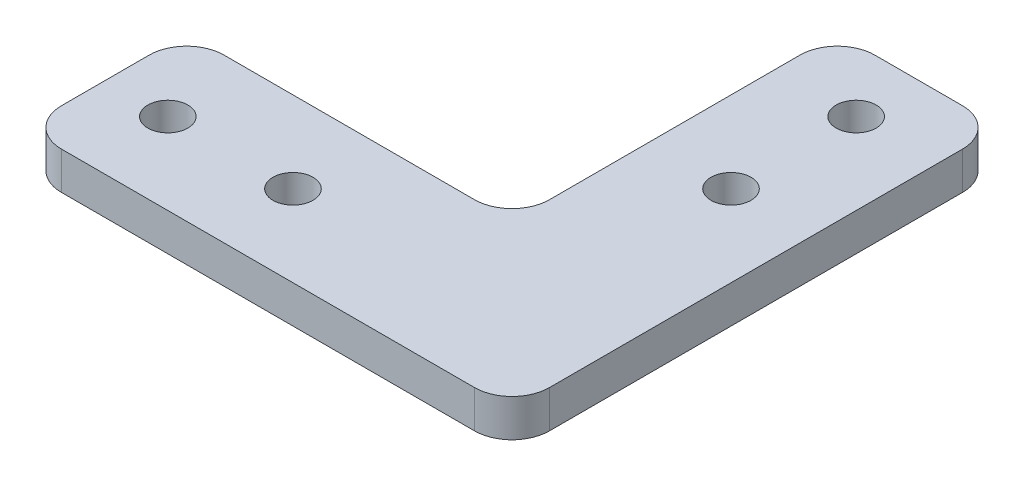
ISO-10303-21;
HEADER;
FILE_DESCRIPTION(('STEP AP214'),'2;1');
FILE_NAME('part.step','',(''),(''),'','','');
FILE_SCHEMA(('AUTOMOTIVE_DESIGN { 1 0 10303 214 1 1 1 1 }'));
ENDSEC;
DATA;
#1=APPLICATION_CONTEXT('core data for automotive mechanical design processes');
#2=APPLICATION_PROTOCOL_DEFINITION('international standard','automotive_design',2000,#1);
#3=PRODUCT_CONTEXT('',#1,'mechanical');
#4=PRODUCT('Part','Part','',(#3));
#5=PRODUCT_RELATED_PRODUCT_CATEGORY('part','',(#4));
#6=PRODUCT_DEFINITION_FORMATION('','',#4);
#7=PRODUCT_DEFINITION_CONTEXT('part definition',#1,'design');
#8=PRODUCT_DEFINITION('design','',#6,#7);
#9=PRODUCT_DEFINITION_SHAPE('','',#8);
#10=(LENGTH_UNIT() NAMED_UNIT(*) SI_UNIT(.MILLI.,.METRE.));
#11=(NAMED_UNIT(*) PLANE_ANGLE_UNIT() SI_UNIT($,.RADIAN.));
#12=(NAMED_UNIT(*) SI_UNIT($,.STERADIAN.) SOLID_ANGLE_UNIT());
#13=UNCERTAINTY_MEASURE_WITH_UNIT(LENGTH_MEASURE(1.E-05),#10,'distance_accuracy_value','');
#14=(GEOMETRIC_REPRESENTATION_CONTEXT(3) GLOBAL_UNCERTAINTY_ASSIGNED_CONTEXT((#13)) GLOBAL_UNIT_ASSIGNED_CONTEXT((#10,
#11,#12)) REPRESENTATION_CONTEXT('',''));
#15=CARTESIAN_POINT('',(0.,0.,0.));
#16=DIRECTION('',(0.,0.,1.));
#17=DIRECTION('',(1.,0.,0.));
#18=AXIS2_PLACEMENT_3D('',#15,#16,#17);
#19=CARTESIAN_POINT('',(-13.,3.,0.));
#20=DIRECTION('',(-1.,0.,0.));
#21=DIRECTION('',(0.,0.,1.));
#22=AXIS2_PLACEMENT_3D('',#19,#20,#21);
#23=PLANE('',#22);
#24=DIRECTION('',(0.,0.,-1.));
#25=VECTOR('',#24,1.);
#26=CARTESIAN_POINT('',(-13.,3.,0.));
#27=LINE('',#26,#25);
#28=CARTESIAN_POINT('',(-13.,3.,-16.));
#29=VERTEX_POINT('',#28);
#30=CARTESIAN_POINT('',(-13.,3.,-36.));
#31=VERTEX_POINT('',#30);
#32=EDGE_CURVE('E242',#29,#31,#27,.T.);
#33=ORIENTED_EDGE('',*,*,#32,.T.);
#34=DIRECTION('',(0.,-1.,0.));
#35=VECTOR('',#34,1.);
#36=CARTESIAN_POINT('',(-13.,0.,-36.));
#37=LINE('',#36,#35);
#38=CARTESIAN_POINT('',(-13.,0.,-36.));
#39=VERTEX_POINT('',#38);
#40=EDGE_CURVE('E148',#31,#39,#37,.T.);
#41=ORIENTED_EDGE('',*,*,#40,.T.);
#42=DIRECTION('',(0.,0.,-1.));
#43=VECTOR('',#42,1.);
#44=CARTESIAN_POINT('',(-13.,0.,0.));
#45=LINE('',#44,#43);
#46=CARTESIAN_POINT('',(-13.,0.,-16.));
#47=VERTEX_POINT('',#46);
#48=EDGE_CURVE('E135',#47,#39,#45,.T.);
#49=ORIENTED_EDGE('',*,*,#48,.F.);
#50=DIRECTION('',(0.,-1.,0.));
#51=VECTOR('',#50,1.);
#52=CARTESIAN_POINT('',(-13.,3.,-16.));
#53=LINE('',#52,#51);
#54=EDGE_CURVE('E145',#47,#29,#53,.F.);
#55=ORIENTED_EDGE('',*,*,#54,.T.);
#56=EDGE_LOOP('',(#33,#41,#49,#55));
#57=FACE_BOUND('',#56,.T.);
#58=ADVANCED_FACE('F43',(#57),#23,.T.);
#59=CARTESIAN_POINT('',(0.,3.,-13.));
#60=DIRECTION('',(0.,0.,-1.));
#61=DIRECTION('',(-1.,0.,0.));
#62=AXIS2_PLACEMENT_3D('',#59,#60,#61);
#63=PLANE('',#62);
#64=DIRECTION('',(1.,0.,0.));
#65=VECTOR('',#64,1.);
#66=CARTESIAN_POINT('',(0.,0.,-13.));
#67=LINE('',#66,#65);
#68=CARTESIAN_POINT('',(-36.,0.,-13.));
#69=VERTEX_POINT('',#68);
#70=CARTESIAN_POINT('',(-16.,0.,-13.));
#71=VERTEX_POINT('',#70);
#72=EDGE_CURVE('E137',#69,#71,#67,.T.);
#73=ORIENTED_EDGE('',*,*,#72,.F.);
#74=DIRECTION('',(0.,-1.,0.));
#75=VECTOR('',#74,1.);
#76=CARTESIAN_POINT('',(-36.,3.,-13.));
#77=LINE('',#76,#75);
#78=CARTESIAN_POINT('',(-36.,3.,-13.));
#79=VERTEX_POINT('',#78);
#80=EDGE_CURVE('E199',#69,#79,#77,.F.);
#81=ORIENTED_EDGE('',*,*,#80,.T.);
#82=DIRECTION('',(1.,0.,0.));
#83=VECTOR('',#82,1.);
#84=CARTESIAN_POINT('',(0.,3.,-13.));
#85=LINE('',#84,#83);
#86=CARTESIAN_POINT('',(-16.,3.,-13.));
#87=VERTEX_POINT('',#86);
#88=EDGE_CURVE('E239',#79,#87,#85,.T.);
#89=ORIENTED_EDGE('',*,*,#88,.T.);
#90=DIRECTION('',(0.,-1.,0.));
#91=VECTOR('',#90,1.);
#92=CARTESIAN_POINT('',(-16.,0.,-13.));
#93=LINE('',#92,#91);
#94=EDGE_CURVE('E197',#87,#71,#93,.T.);
#95=ORIENTED_EDGE('',*,*,#94,.T.);
#96=EDGE_LOOP('',(#73,#81,#89,#95));
#97=FACE_BOUND('',#96,.T.);
#98=ADVANCED_FACE('F287',(#97),#63,.T.);
#99=CARTESIAN_POINT('',(-39.,3.,0.));
#100=DIRECTION('',(-1.,0.,0.));
#101=DIRECTION('',(0.,0.,1.));
#102=AXIS2_PLACEMENT_3D('',#99,#100,#101);
#103=PLANE('',#102);
#104=DIRECTION('',(0.,0.,-1.));
#105=VECTOR('',#104,1.);
#106=CARTESIAN_POINT('',(-39.,0.,0.));
#107=LINE('',#106,#105);
#108=CARTESIAN_POINT('',(-39.,0.,-3.));
#109=VERTEX_POINT('',#108);
#110=CARTESIAN_POINT('',(-39.,0.,-9.99999999999999));
#111=VERTEX_POINT('',#110);
#112=EDGE_CURVE('E215',#109,#111,#107,.T.);
#113=ORIENTED_EDGE('',*,*,#112,.F.);
#114=DIRECTION('',(0.,-1.,0.));
#115=VECTOR('',#114,1.);
#116=CARTESIAN_POINT('',(-39.,3.,-3.));
#117=LINE('',#116,#115);
#118=CARTESIAN_POINT('',(-39.,3.,-3.));
#119=VERTEX_POINT('',#118);
#120=EDGE_CURVE('E195',#109,#119,#117,.F.);
#121=ORIENTED_EDGE('',*,*,#120,.T.);
#122=DIRECTION('',(0.,0.,-1.));
#123=VECTOR('',#122,1.);
#124=CARTESIAN_POINT('',(-39.,3.,0.));
#125=LINE('',#124,#123);
#126=CARTESIAN_POINT('',(-39.,3.,-9.99999999999999));
#127=VERTEX_POINT('',#126);
#128=EDGE_CURVE('E236',#119,#127,#125,.T.);
#129=ORIENTED_EDGE('',*,*,#128,.T.);
#130=DIRECTION('',(0.,-1.,0.));
#131=VECTOR('',#130,1.);
#132=CARTESIAN_POINT('',(-39.,3.,-9.99999999999999));
#133=LINE('',#132,#131);
#134=EDGE_CURVE('E192',#127,#111,#133,.T.);
#135=ORIENTED_EDGE('',*,*,#134,.T.);
#136=EDGE_LOOP('',(#113,#121,#129,#135));
#137=FACE_BOUND('',#136,.T.);
#138=ADVANCED_FACE('F293',(#137),#103,.T.);
#139=CARTESIAN_POINT('',(0.,3.,0.));
#140=DIRECTION('',(0.,0.,1.));
#141=DIRECTION('',(1.,0.,0.));
#142=AXIS2_PLACEMENT_3D('',#139,#140,#141);
#143=PLANE('',#142);
#144=DIRECTION('',(-1.,0.,0.));
#145=VECTOR('',#144,1.);
#146=CARTESIAN_POINT('',(0.,3.,0.));
#147=LINE('',#146,#145);
#148=CARTESIAN_POINT('',(-3.,3.,0.));
#149=VERTEX_POINT('',#148);
#150=CARTESIAN_POINT('',(-36.,3.,0.));
#151=VERTEX_POINT('',#150);
#152=EDGE_CURVE('E233',#149,#151,#147,.T.);
#153=ORIENTED_EDGE('',*,*,#152,.T.);
#154=DIRECTION('',(0.,-1.,0.));
#155=VECTOR('',#154,1.);
#156=CARTESIAN_POINT('',(-36.,3.,0.));
#157=LINE('',#156,#155);
#158=CARTESIAN_POINT('',(-36.,0.,0.));
#159=VERTEX_POINT('',#158);
#160=EDGE_CURVE('E189',#151,#159,#157,.T.);
#161=ORIENTED_EDGE('',*,*,#160,.T.);
#162=DIRECTION('',(-1.,0.,0.));
#163=VECTOR('',#162,1.);
#164=CARTESIAN_POINT('',(0.,0.,0.));
#165=LINE('',#164,#163);
#166=CARTESIAN_POINT('',(-3.,0.,0.));
#167=VERTEX_POINT('',#166);
#168=EDGE_CURVE('E212',#167,#159,#165,.T.);
#169=ORIENTED_EDGE('',*,*,#168,.F.);
#170=DIRECTION('',(0.,-1.,0.));
#171=VECTOR('',#170,1.);
#172=CARTESIAN_POINT('',(-3.,3.,0.));
#173=LINE('',#172,#171);
#174=EDGE_CURVE('E187',#167,#149,#173,.F.);
#175=ORIENTED_EDGE('',*,*,#174,.T.);
#176=EDGE_LOOP('',(#153,#161,#169,#175));
#177=FACE_BOUND('',#176,.T.);
#178=ADVANCED_FACE('F332',(#177),#143,.T.);
#179=CARTESIAN_POINT('',(0.,3.,0.));
#180=DIRECTION('',(-1.,0.,0.));
#181=DIRECTION('',(0.,0.,1.));
#182=AXIS2_PLACEMENT_3D('',#179,#180,#181);
#183=PLANE('',#182);
#184=DIRECTION('',(0.,0.,-1.));
#185=VECTOR('',#184,1.);
#186=CARTESIAN_POINT('',(0.,0.,0.));
#187=LINE('',#186,#185);
#188=CARTESIAN_POINT('',(0.,0.,-3.));
#189=VERTEX_POINT('',#188);
#190=CARTESIAN_POINT('',(0.,0.,-36.));
#191=VERTEX_POINT('',#190);
#192=EDGE_CURVE('E207',#189,#191,#187,.T.);
#193=ORIENTED_EDGE('',*,*,#192,.T.);
#194=DIRECTION('',(0.,-1.,0.));
#195=VECTOR('',#194,1.);
#196=CARTESIAN_POINT('',(0.,3.,-36.));
#197=LINE('',#196,#195);
#198=CARTESIAN_POINT('',(0.,3.,-36.));
#199=VERTEX_POINT('',#198);
#200=EDGE_CURVE('E58',#191,#199,#197,.F.);
#201=ORIENTED_EDGE('',*,*,#200,.T.);
#202=DIRECTION('',(0.,0.,-1.));
#203=VECTOR('',#202,1.);
#204=CARTESIAN_POINT('',(0.,3.,0.));
#205=LINE('',#204,#203);
#206=CARTESIAN_POINT('',(0.,3.,-3.));
#207=VERTEX_POINT('',#206);
#208=EDGE_CURVE('E158',#207,#199,#205,.T.);
#209=ORIENTED_EDGE('',*,*,#208,.F.);
#210=DIRECTION('',(0.,-1.,0.));
#211=VECTOR('',#210,1.);
#212=CARTESIAN_POINT('',(0.,0.,-3.));
#213=LINE('',#212,#211);
#214=EDGE_CURVE('E201',#207,#189,#213,.T.);
#215=ORIENTED_EDGE('',*,*,#214,.T.);
#216=EDGE_LOOP('',(#193,#201,#209,#215));
#217=FACE_BOUND('',#216,.T.);
#218=ADVANCED_FACE('F206',(#217),#183,.F.);
#219=CARTESIAN_POINT('',(-24.,3.,-6.49999999999999));
#220=DIRECTION('',(0.,-1.,0.));
#221=DIRECTION('',(0.,0.,-1.));
#222=AXIS2_PLACEMENT_3D('',#219,#220,#221);
#223=CYLINDRICAL_SURFACE('',#222,1.6);
#224=CARTESIAN_POINT('',(-24.,3.,-6.49999999999999));
#225=DIRECTION('',(0.,1.,0.));
#226=DIRECTION('',(0.,0.,1.));
#227=AXIS2_PLACEMENT_3D('',#224,#225,#226);
#228=CIRCLE('',#227,1.6);
#229=CARTESIAN_POINT('',(-24.,3.,-4.89999999999999));
#230=VERTEX_POINT('',#229);
#231=EDGE_CURVE('E244',#230,#230,#228,.T.);
#232=ORIENTED_EDGE('',*,*,#231,.T.);
#233=EDGE_LOOP('',(#232));
#234=FACE_BOUND('',#233,.T.);
#235=CARTESIAN_POINT('',(-24.,0.,-6.49999999999999));
#236=DIRECTION('',(0.,1.,0.));
#237=DIRECTION('',(0.,0.,1.));
#238=AXIS2_PLACEMENT_3D('',#235,#236,#237);
#239=CIRCLE('',#238,1.6);
#240=CARTESIAN_POINT('',(-24.,0.,-4.89999999999999));
#241=VERTEX_POINT('',#240);
#242=EDGE_CURVE('E149',#241,#241,#239,.T.);
#243=ORIENTED_EDGE('',*,*,#242,.F.);
#244=EDGE_LOOP('',(#243));
#245=FACE_BOUND('',#244,.T.);
#246=ADVANCED_FACE('F298',(#234,#245),#223,.F.);
#247=CARTESIAN_POINT('',(-34.,3.,-6.49999999999999));
#248=DIRECTION('',(0.,-1.,0.));
#249=DIRECTION('',(0.,0.,-1.));
#250=AXIS2_PLACEMENT_3D('',#247,#248,#249);
#251=CYLINDRICAL_SURFACE('',#250,1.6);
#252=CARTESIAN_POINT('',(-34.,3.,-6.49999999999999));
#253=DIRECTION('',(0.,1.,0.));
#254=DIRECTION('',(0.,0.,1.));
#255=AXIS2_PLACEMENT_3D('',#252,#253,#254);
#256=CIRCLE('',#255,1.6);
#257=CARTESIAN_POINT('',(-34.,3.,-4.9));
#258=VERTEX_POINT('',#257);
#259=EDGE_CURVE('E247',#258,#258,#256,.T.);
#260=ORIENTED_EDGE('',*,*,#259,.T.);
#261=EDGE_LOOP('',(#260));
#262=FACE_BOUND('',#261,.T.);
#263=CARTESIAN_POINT('',(-34.,0.,-6.49999999999999));
#264=DIRECTION('',(0.,1.,0.));
#265=DIRECTION('',(0.,0.,1.));
#266=AXIS2_PLACEMENT_3D('',#263,#264,#265);
#267=CIRCLE('',#266,1.6);
#268=CARTESIAN_POINT('',(-34.,0.,-4.9));
#269=VERTEX_POINT('',#268);
#270=EDGE_CURVE('E223',#269,#269,#267,.T.);
#271=ORIENTED_EDGE('',*,*,#270,.F.);
#272=EDGE_LOOP('',(#271));
#273=FACE_BOUND('',#272,.T.);
#274=ADVANCED_FACE('F301',(#262,#273),#251,.F.);
#275=CARTESIAN_POINT('',(-6.5,3.,-24.));
#276=DIRECTION('',(0.,-1.,0.));
#277=DIRECTION('',(0.,0.,-1.));
#278=AXIS2_PLACEMENT_3D('',#275,#276,#277);
#279=CYLINDRICAL_SURFACE('',#278,1.6);
#280=CARTESIAN_POINT('',(-6.5,3.,-24.));
#281=DIRECTION('',(0.,1.,0.));
#282=DIRECTION('',(0.,0.,1.));
#283=AXIS2_PLACEMENT_3D('',#280,#281,#282);
#284=CIRCLE('',#283,1.6);
#285=CARTESIAN_POINT('',(-6.5,3.,-22.4));
#286=VERTEX_POINT('',#285);
#287=EDGE_CURVE('E250',#286,#286,#284,.T.);
#288=ORIENTED_EDGE('',*,*,#287,.T.);
#289=EDGE_LOOP('',(#288));
#290=FACE_BOUND('',#289,.T.);
#291=CARTESIAN_POINT('',(-6.5,0.,-24.));
#292=DIRECTION('',(0.,1.,0.));
#293=DIRECTION('',(0.,0.,1.));
#294=AXIS2_PLACEMENT_3D('',#291,#292,#293);
#295=CIRCLE('',#294,1.6);
#296=CARTESIAN_POINT('',(-6.5,0.,-22.4));
#297=VERTEX_POINT('',#296);
#298=EDGE_CURVE('E226',#297,#297,#295,.T.);
#299=ORIENTED_EDGE('',*,*,#298,.F.);
#300=EDGE_LOOP('',(#299));
#301=FACE_BOUND('',#300,.T.);
#302=ADVANCED_FACE('F305',(#290,#301),#279,.F.);
#303=CARTESIAN_POINT('',(-6.5,3.,-34.));
#304=DIRECTION('',(0.,-1.,0.));
#305=DIRECTION('',(0.,0.,-1.));
#306=AXIS2_PLACEMENT_3D('',#303,#304,#305);
#307=CYLINDRICAL_SURFACE('',#306,1.6);
#308=CARTESIAN_POINT('',(-6.5,3.,-34.));
#309=DIRECTION('',(0.,1.,0.));
#310=DIRECTION('',(0.,0.,1.));
#311=AXIS2_PLACEMENT_3D('',#308,#309,#310);
#312=CIRCLE('',#311,1.6);
#313=CARTESIAN_POINT('',(-6.5,3.,-32.4));
#314=VERTEX_POINT('',#313);
#315=EDGE_CURVE('E214',#314,#314,#312,.T.);
#316=ORIENTED_EDGE('',*,*,#315,.T.);
#317=EDGE_LOOP('',(#316));
#318=FACE_BOUND('',#317,.T.);
#319=CARTESIAN_POINT('',(-6.5,0.,-34.));
#320=DIRECTION('',(0.,1.,0.));
#321=DIRECTION('',(0.,0.,1.));
#322=AXIS2_PLACEMENT_3D('',#319,#320,#321);
#323=CIRCLE('',#322,1.6);
#324=CARTESIAN_POINT('',(-6.5,0.,-32.4));
#325=VERTEX_POINT('',#324);
#326=EDGE_CURVE('E229',#325,#325,#323,.T.);
#327=ORIENTED_EDGE('',*,*,#326,.F.);
#328=EDGE_LOOP('',(#327));
#329=FACE_BOUND('',#328,.T.);
#330=ADVANCED_FACE('F256',(#318,#329),#307,.F.);
#331=CARTESIAN_POINT('',(0.,3.,-39.));
#332=DIRECTION('',(0.,0.,1.));
#333=DIRECTION('',(1.,0.,0.));
#334=AXIS2_PLACEMENT_3D('',#331,#332,#333);
#335=PLANE('',#334);
#336=DIRECTION('',(-1.,0.,0.));
#337=VECTOR('',#336,1.);
#338=CARTESIAN_POINT('',(0.,0.,-39.));
#339=LINE('',#338,#337);
#340=CARTESIAN_POINT('',(-3.,0.,-39.));
#341=VERTEX_POINT('',#340);
#342=CARTESIAN_POINT('',(-10.,0.,-39.));
#343=VERTEX_POINT('',#342);
#344=EDGE_CURVE('E161',#341,#343,#339,.T.);
#345=ORIENTED_EDGE('',*,*,#344,.T.);
#346=DIRECTION('',(0.,-1.,0.));
#347=VECTOR('',#346,1.);
#348=CARTESIAN_POINT('',(-10.,3.,-39.));
#349=LINE('',#348,#347);
#350=CARTESIAN_POINT('',(-10.,3.,-39.));
#351=VERTEX_POINT('',#350);
#352=EDGE_CURVE('E176',#343,#351,#349,.F.);
#353=ORIENTED_EDGE('',*,*,#352,.T.);
#354=DIRECTION('',(-1.,0.,0.));
#355=VECTOR('',#354,1.);
#356=CARTESIAN_POINT('',(0.,3.,-39.));
#357=LINE('',#356,#355);
#358=CARTESIAN_POINT('',(-3.,3.,-39.));
#359=VERTEX_POINT('',#358);
#360=EDGE_CURVE('E153',#359,#351,#357,.T.);
#361=ORIENTED_EDGE('',*,*,#360,.F.);
#362=DIRECTION('',(0.,-1.,0.));
#363=VECTOR('',#362,1.);
#364=CARTESIAN_POINT('',(-3.,3.,-39.));
#365=LINE('',#364,#363);
#366=EDGE_CURVE('E173',#359,#341,#365,.T.);
#367=ORIENTED_EDGE('',*,*,#366,.T.);
#368=EDGE_LOOP('',(#345,#353,#361,#367));
#369=FACE_BOUND('',#368,.T.);
#370=ADVANCED_FACE('F262',(#369),#335,.F.);
#371=CARTESIAN_POINT('',(0.,3.,0.));
#372=DIRECTION('',(0.,1.,0.));
#373=DIRECTION('',(0.,0.,1.));
#374=AXIS2_PLACEMENT_3D('',#371,#372,#373);
#375=PLANE('',#374);
#376=ORIENTED_EDGE('',*,*,#315,.F.);
#377=EDGE_LOOP('',(#376));
#378=FACE_BOUND('',#377,.T.);
#379=ORIENTED_EDGE('',*,*,#287,.F.);
#380=EDGE_LOOP('',(#379));
#381=FACE_BOUND('',#380,.T.);
#382=ORIENTED_EDGE('',*,*,#259,.F.);
#383=EDGE_LOOP('',(#382));
#384=FACE_BOUND('',#383,.T.);
#385=ORIENTED_EDGE('',*,*,#231,.F.);
#386=EDGE_LOOP('',(#385));
#387=FACE_BOUND('',#386,.T.);
#388=ORIENTED_EDGE('',*,*,#360,.T.);
#389=CARTESIAN_POINT('',(-10.,3.,-36.));
#390=DIRECTION('',(0.,1.,0.));
#391=DIRECTION('',(0.,0.,1.));
#392=AXIS2_PLACEMENT_3D('',#389,#390,#391);
#393=CIRCLE('',#392,3.);
#394=EDGE_CURVE('E185',#351,#31,#393,.T.);
#395=ORIENTED_EDGE('',*,*,#394,.T.);
#396=ORIENTED_EDGE('',*,*,#32,.F.);
#397=CARTESIAN_POINT('',(-16.,3.,-16.));
#398=DIRECTION('',(0.,1.,0.));
#399=DIRECTION('',(0.,0.,1.));
#400=AXIS2_PLACEMENT_3D('',#397,#398,#399);
#401=CIRCLE('',#400,3.);
#402=EDGE_CURVE('E11',#29,#87,#401,.F.);
#403=ORIENTED_EDGE('',*,*,#402,.T.);
#404=ORIENTED_EDGE('',*,*,#88,.F.);
#405=CARTESIAN_POINT('',(-36.,3.,-9.99999999999999));
#406=DIRECTION('',(0.,1.,0.));
#407=DIRECTION('',(0.,0.,1.));
#408=AXIS2_PLACEMENT_3D('',#405,#406,#407);
#409=CIRCLE('',#408,3.);
#410=EDGE_CURVE('E181',#79,#127,#409,.T.);
#411=ORIENTED_EDGE('',*,*,#410,.T.);
#412=ORIENTED_EDGE('',*,*,#128,.F.);
#413=CARTESIAN_POINT('',(-36.,3.,-3.));
#414=DIRECTION('',(0.,1.,0.));
#415=DIRECTION('',(0.,0.,1.));
#416=AXIS2_PLACEMENT_3D('',#413,#414,#415);
#417=CIRCLE('',#416,3.);
#418=EDGE_CURVE('E183',#119,#151,#417,.T.);
#419=ORIENTED_EDGE('',*,*,#418,.T.);
#420=ORIENTED_EDGE('',*,*,#152,.F.);
#421=CARTESIAN_POINT('',(-3.,3.,-3.));
#422=DIRECTION('',(0.,1.,0.));
#423=DIRECTION('',(0.,0.,1.));
#424=AXIS2_PLACEMENT_3D('',#421,#422,#423);
#425=CIRCLE('',#424,3.);
#426=EDGE_CURVE('E65',#149,#207,#425,.T.);
#427=ORIENTED_EDGE('',*,*,#426,.T.);
#428=ORIENTED_EDGE('',*,*,#208,.T.);
#429=CARTESIAN_POINT('',(-3.,3.,-36.));
#430=DIRECTION('',(0.,1.,0.));
#431=DIRECTION('',(0.,0.,1.));
#432=AXIS2_PLACEMENT_3D('',#429,#430,#431);
#433=CIRCLE('',#432,3.);
#434=EDGE_CURVE('E179',#199,#359,#433,.T.);
#435=ORIENTED_EDGE('',*,*,#434,.T.);
#436=EDGE_LOOP('',(#388,#395,#396,#403,#404,#411,#412,#419,#420,#427,#428,#435));
#437=FACE_BOUND('',#436,.T.);
#438=ADVANCED_FACE('F259',(#378,#381,#384,#387,#437),#375,.T.);
#439=CARTESIAN_POINT('',(0.,0.,0.));
#440=DIRECTION('',(0.,1.,0.));
#441=DIRECTION('',(0.,0.,1.));
#442=AXIS2_PLACEMENT_3D('',#439,#440,#441);
#443=PLANE('',#442);
#444=ORIENTED_EDGE('',*,*,#326,.T.);
#445=EDGE_LOOP('',(#444));
#446=FACE_BOUND('',#445,.T.);
#447=ORIENTED_EDGE('',*,*,#298,.T.);
#448=EDGE_LOOP('',(#447));
#449=FACE_BOUND('',#448,.T.);
#450=ORIENTED_EDGE('',*,*,#270,.T.);
#451=EDGE_LOOP('',(#450));
#452=FACE_BOUND('',#451,.T.);
#453=ORIENTED_EDGE('',*,*,#242,.T.);
#454=EDGE_LOOP('',(#453));
#455=FACE_BOUND('',#454,.T.);
#456=ORIENTED_EDGE('',*,*,#48,.T.);
#457=CARTESIAN_POINT('',(-10.,0.,-36.));
#458=DIRECTION('',(0.,1.,0.));
#459=DIRECTION('',(0.,0.,1.));
#460=AXIS2_PLACEMENT_3D('',#457,#458,#459);
#461=CIRCLE('',#460,3.);
#462=EDGE_CURVE('E171',#39,#343,#461,.F.);
#463=ORIENTED_EDGE('',*,*,#462,.T.);
#464=ORIENTED_EDGE('',*,*,#344,.F.);
#465=CARTESIAN_POINT('',(-3.,0.,-36.));
#466=DIRECTION('',(0.,1.,0.));
#467=DIRECTION('',(0.,0.,1.));
#468=AXIS2_PLACEMENT_3D('',#465,#466,#467);
#469=CIRCLE('',#468,3.);
#470=EDGE_CURVE('E165',#341,#191,#469,.F.);
#471=ORIENTED_EDGE('',*,*,#470,.T.);
#472=ORIENTED_EDGE('',*,*,#192,.F.);
#473=CARTESIAN_POINT('',(-3.,0.,-3.));
#474=DIRECTION('',(0.,1.,0.));
#475=DIRECTION('',(0.,0.,1.));
#476=AXIS2_PLACEMENT_3D('',#473,#474,#475);
#477=CIRCLE('',#476,3.);
#478=EDGE_CURVE('E155',#189,#167,#477,.F.);
#479=ORIENTED_EDGE('',*,*,#478,.T.);
#480=ORIENTED_EDGE('',*,*,#168,.T.);
#481=CARTESIAN_POINT('',(-36.,0.,-3.));
#482=DIRECTION('',(0.,1.,0.));
#483=DIRECTION('',(0.,0.,1.));
#484=AXIS2_PLACEMENT_3D('',#481,#482,#483);
#485=CIRCLE('',#484,3.);
#486=EDGE_CURVE('E169',#159,#109,#485,.F.);
#487=ORIENTED_EDGE('',*,*,#486,.T.);
#488=ORIENTED_EDGE('',*,*,#112,.T.);
#489=CARTESIAN_POINT('',(-36.,0.,-9.99999999999999));
#490=DIRECTION('',(0.,1.,0.));
#491=DIRECTION('',(0.,0.,1.));
#492=AXIS2_PLACEMENT_3D('',#489,#490,#491);
#493=CIRCLE('',#492,3.);
#494=EDGE_CURVE('E167',#111,#69,#493,.F.);
#495=ORIENTED_EDGE('',*,*,#494,.T.);
#496=ORIENTED_EDGE('',*,*,#72,.T.);
#497=CARTESIAN_POINT('',(-16.,0.,-16.));
#498=DIRECTION('',(0.,1.,0.));
#499=DIRECTION('',(0.,0.,1.));
#500=AXIS2_PLACEMENT_3D('',#497,#498,#499);
#501=CIRCLE('',#500,3.);
#502=EDGE_CURVE('E51',#71,#47,#501,.T.);
#503=ORIENTED_EDGE('',*,*,#502,.T.);
#504=EDGE_LOOP('',(#456,#463,#464,#471,#472,#479,#480,#487,#488,#495,#496,#503));
#505=FACE_BOUND('',#504,.T.);
#506=ADVANCED_FACE('F134',(#446,#449,#452,#455,#505),#443,.F.);
#507=CARTESIAN_POINT('',(-10.,3.,-36.));
#508=DIRECTION('',(0.,1.,0.));
#509=DIRECTION('',(0.,0.,1.));
#510=AXIS2_PLACEMENT_3D('',#507,#508,#509);
#511=CYLINDRICAL_SURFACE('',#510,3.);
#512=ORIENTED_EDGE('',*,*,#394,.F.);
#513=ORIENTED_EDGE('',*,*,#352,.F.);
#514=ORIENTED_EDGE('',*,*,#462,.F.);
#515=ORIENTED_EDGE('',*,*,#40,.F.);
#516=EDGE_LOOP('',(#512,#513,#514,#515));
#517=FACE_BOUND('',#516,.T.);
#518=ADVANCED_FACE('F276',(#517),#511,.T.);
#519=CARTESIAN_POINT('',(-36.,3.,-3.));
#520=DIRECTION('',(0.,-1.,0.));
#521=DIRECTION('',(0.,0.,-1.));
#522=AXIS2_PLACEMENT_3D('',#519,#520,#521);
#523=CYLINDRICAL_SURFACE('',#522,3.);
#524=ORIENTED_EDGE('',*,*,#418,.F.);
#525=ORIENTED_EDGE('',*,*,#120,.F.);
#526=ORIENTED_EDGE('',*,*,#486,.F.);
#527=ORIENTED_EDGE('',*,*,#160,.F.);
#528=EDGE_LOOP('',(#524,#525,#526,#527));
#529=FACE_BOUND('',#528,.T.);
#530=ADVANCED_FACE('F313',(#529),#523,.T.);
#531=CARTESIAN_POINT('',(-36.,3.,-9.99999999999999));
#532=DIRECTION('',(0.,-1.,0.));
#533=DIRECTION('',(0.,0.,-1.));
#534=AXIS2_PLACEMENT_3D('',#531,#532,#533);
#535=CYLINDRICAL_SURFACE('',#534,3.);
#536=ORIENTED_EDGE('',*,*,#410,.F.);
#537=ORIENTED_EDGE('',*,*,#80,.F.);
#538=ORIENTED_EDGE('',*,*,#494,.F.);
#539=ORIENTED_EDGE('',*,*,#134,.F.);
#540=EDGE_LOOP('',(#536,#537,#538,#539));
#541=FACE_BOUND('',#540,.T.);
#542=ADVANCED_FACE('F284',(#541),#535,.T.);
#543=CARTESIAN_POINT('',(-16.,3.,-16.));
#544=DIRECTION('',(0.,1.,0.));
#545=DIRECTION('',(0.,0.,1.));
#546=AXIS2_PLACEMENT_3D('',#543,#544,#545);
#547=CYLINDRICAL_SURFACE('',#546,3.);
#548=ORIENTED_EDGE('',*,*,#402,.F.);
#549=ORIENTED_EDGE('',*,*,#54,.F.);
#550=ORIENTED_EDGE('',*,*,#502,.F.);
#551=ORIENTED_EDGE('',*,*,#94,.F.);
#552=EDGE_LOOP('',(#548,#549,#550,#551));
#553=FACE_BOUND('',#552,.T.);
#554=ADVANCED_FACE('F152',(#553),#547,.F.);
#555=CARTESIAN_POINT('',(-3.,3.,-36.));
#556=DIRECTION('',(0.,-1.,0.));
#557=DIRECTION('',(0.,0.,-1.));
#558=AXIS2_PLACEMENT_3D('',#555,#556,#557);
#559=CYLINDRICAL_SURFACE('',#558,3.);
#560=ORIENTED_EDGE('',*,*,#434,.F.);
#561=ORIENTED_EDGE('',*,*,#200,.F.);
#562=ORIENTED_EDGE('',*,*,#470,.F.);
#563=ORIENTED_EDGE('',*,*,#366,.F.);
#564=EDGE_LOOP('',(#560,#561,#562,#563));
#565=FACE_BOUND('',#564,.T.);
#566=ADVANCED_FACE('F278',(#565),#559,.T.);
#567=CARTESIAN_POINT('',(-3.,3.,-3.));
#568=DIRECTION('',(0.,1.,0.));
#569=DIRECTION('',(0.,0.,1.));
#570=AXIS2_PLACEMENT_3D('',#567,#568,#569);
#571=CYLINDRICAL_SURFACE('',#570,3.);
#572=ORIENTED_EDGE('',*,*,#426,.F.);
#573=ORIENTED_EDGE('',*,*,#174,.F.);
#574=ORIENTED_EDGE('',*,*,#478,.F.);
#575=ORIENTED_EDGE('',*,*,#214,.F.);
#576=EDGE_LOOP('',(#572,#573,#574,#575));
#577=FACE_BOUND('',#576,.T.);
#578=ADVANCED_FACE('F45',(#577),#571,.T.);
#579=CLOSED_SHELL('',(#58,#98,#138,#178,#218,#246,#274,#302,#330,#370,#438,#506,#518,#530,#542,
#554,#566,#578));
#580=MANIFOLD_SOLID_BREP('B2',#579);
#581=ADVANCED_BREP_SHAPE_REPRESENTATION('',(#18,#580),#14);
#582=SHAPE_DEFINITION_REPRESENTATION(#9,#581);
ENDSEC;
END-ISO-10303-21;
